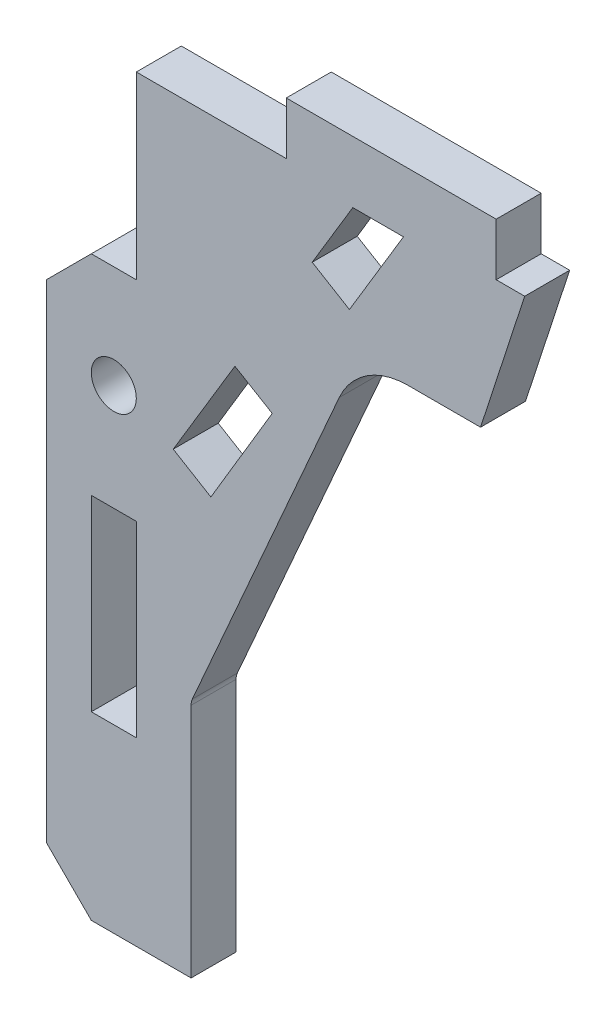
ISO-10303-21;
HEADER;
FILE_DESCRIPTION(('STEP AP214'),'2;1');
FILE_NAME('part.step','',(''),(''),'','','');
FILE_SCHEMA(('AUTOMOTIVE_DESIGN { 1 0 10303 214 1 1 1 1 }'));
ENDSEC;
DATA;
#1=APPLICATION_CONTEXT('core data for automotive mechanical design processes');
#2=APPLICATION_PROTOCOL_DEFINITION('international standard','automotive_design',2000,#1);
#3=PRODUCT_CONTEXT('',#1,'mechanical');
#4=PRODUCT('Part','Part','',(#3));
#5=PRODUCT_RELATED_PRODUCT_CATEGORY('part','',(#4));
#6=PRODUCT_DEFINITION_FORMATION('','',#4);
#7=PRODUCT_DEFINITION_CONTEXT('part definition',#1,'design');
#8=PRODUCT_DEFINITION('design','',#6,#7);
#9=PRODUCT_DEFINITION_SHAPE('','',#8);
#10=(LENGTH_UNIT() NAMED_UNIT(*) SI_UNIT(.MILLI.,.METRE.));
#11=(NAMED_UNIT(*) PLANE_ANGLE_UNIT() SI_UNIT($,.RADIAN.));
#12=(NAMED_UNIT(*) SI_UNIT($,.STERADIAN.) SOLID_ANGLE_UNIT());
#13=UNCERTAINTY_MEASURE_WITH_UNIT(LENGTH_MEASURE(1.E-05),#10,'distance_accuracy_value','');
#14=(GEOMETRIC_REPRESENTATION_CONTEXT(3) GLOBAL_UNCERTAINTY_ASSIGNED_CONTEXT((#13)) GLOBAL_UNIT_ASSIGNED_CONTEXT((#10,
#11,#12)) REPRESENTATION_CONTEXT('',''));
#15=CARTESIAN_POINT('',(0.,0.,0.));
#16=DIRECTION('',(0.,0.,1.));
#17=DIRECTION('',(1.,0.,0.));
#18=AXIS2_PLACEMENT_3D('',#15,#16,#17);
#19=CARTESIAN_POINT('',(0.,0.,3.));
#20=DIRECTION('',(0.,0.,1.));
#21=DIRECTION('',(1.,0.,0.));
#22=AXIS2_PLACEMENT_3D('',#19,#20,#21);
#23=PLANE('',#22);
#24=DIRECTION('',(0.,-1.,0.));
#25=VECTOR('',#24,1.);
#26=CARTESIAN_POINT('',(-18.7464779765645,-4.03817773949884,3.));
#27=LINE('',#26,#25);
#28=CARTESIAN_POINT('',(-18.7464779765645,-4.24802507912212,3.));
#29=VERTEX_POINT('',#28);
#30=CARTESIAN_POINT('',(-18.7464779765645,-20.0000000000003,3.));
#31=VERTEX_POINT('',#30);
#32=EDGE_CURVE('E235',#29,#31,#27,.T.);
#33=ORIENTED_EDGE('',*,*,#32,.F.);
#34=CARTESIAN_POINT('',(-17.7464779765645,-4.24802507912212,3.));
#35=DIRECTION('',(0.,0.,1.));
#36=DIRECTION('',(1.,0.,0.));
#37=AXIS2_PLACEMENT_3D('',#34,#35,#36);
#38=CIRCLE('',#37,1.);
#39=CARTESIAN_POINT('',(-18.6621209047509,-3.84603250697404,3.));
#40=VERTEX_POINT('',#39);
#41=EDGE_CURVE('E53',#29,#40,#38,.F.);
#42=ORIENTED_EDGE('',*,*,#41,.T.);
#43=DIRECTION('',(0.401992572148069,0.915642928186408,0.));
#44=VECTOR('',#43,1.);
#45=CARTESIAN_POINT('',(-7.98173309390254,20.4813363223423,3.));
#46=LINE('',#45,#44);
#47=CARTESIAN_POINT('',(-8.86454232708025,18.4705080451494,3.));
#48=VERTEX_POINT('',#47);
#49=EDGE_CURVE('E487',#40,#48,#46,.T.);
#50=ORIENTED_EDGE('',*,*,#49,.T.);
#51=CARTESIAN_POINT('',(-4.28632768614821,16.4605451844091,3.));
#52=DIRECTION('',(0.,0.,1.));
#53=DIRECTION('',(1.,0.,0.));
#54=AXIS2_PLACEMENT_3D('',#51,#52,#53);
#55=CIRCLE('',#54,5.);
#56=CARTESIAN_POINT('',(-4.28632768614821,21.4605451844091,3.));
#57=VERTEX_POINT('',#56);
#58=EDGE_CURVE('E373',#48,#57,#55,.F.);
#59=ORIENTED_EDGE('',*,*,#58,.T.);
#60=DIRECTION('',(1.,0.,0.));
#61=VECTOR('',#60,1.);
#62=CARTESIAN_POINT('',(0.,21.4605451844091,3.));
#63=LINE('',#62,#61);
#64=CARTESIAN_POINT('',(0.556836156925899,21.4605451844091,3.));
#65=VERTEX_POINT('',#64);
#66=EDGE_CURVE('E432',#57,#65,#63,.T.);
#67=ORIENTED_EDGE('',*,*,#66,.T.);
#68=DIRECTION('',(-0.309594182225636,-0.950868782920146,0.));
#69=VECTOR('',#68,1.);
#70=CARTESIAN_POINT('',(3.50000000000001,30.5,3.));
#71=LINE('',#70,#69);
#72=CARTESIAN_POINT('',(3.50000000000001,30.5,3.));
#73=VERTEX_POINT('',#72);
#74=EDGE_CURVE('E409',#73,#65,#71,.T.);
#75=ORIENTED_EDGE('',*,*,#74,.F.);
#76=DIRECTION('',(-1.,0.,0.));
#77=VECTOR('',#76,1.);
#78=CARTESIAN_POINT('',(17.4,30.5,3.));
#79=LINE('',#78,#77);
#80=CARTESIAN_POINT('',(1.60000000000001,30.5,3.));
#81=VERTEX_POINT('',#80);
#82=EDGE_CURVE('E261',#73,#81,#79,.T.);
#83=ORIENTED_EDGE('',*,*,#82,.T.);
#84=DIRECTION('',(0.,1.,0.));
#85=VECTOR('',#84,1.);
#86=CARTESIAN_POINT('',(1.60000000000001,30.5,3.));
#87=LINE('',#86,#85);
#88=CARTESIAN_POINT('',(1.60000000000001,34.,3.));
#89=VERTEX_POINT('',#88);
#90=EDGE_CURVE('E266',#81,#89,#87,.T.);
#91=ORIENTED_EDGE('',*,*,#90,.T.);
#92=DIRECTION('',(-1.,0.,0.));
#93=VECTOR('',#92,1.);
#94=CARTESIAN_POINT('',(1.60000000000001,34.,3.));
#95=LINE('',#94,#93);
#96=CARTESIAN_POINT('',(-12.4,34.,3.));
#97=VERTEX_POINT('',#96);
#98=EDGE_CURVE('E274',#89,#97,#95,.T.);
#99=ORIENTED_EDGE('',*,*,#98,.T.);
#100=DIRECTION('',(0.,-1.,0.));
#101=VECTOR('',#100,1.);
#102=CARTESIAN_POINT('',(-12.4,34.,3.));
#103=LINE('',#102,#101);
#104=CARTESIAN_POINT('',(-12.4,30.5,3.));
#105=VERTEX_POINT('',#104);
#106=EDGE_CURVE('E277',#97,#105,#103,.T.);
#107=ORIENTED_EDGE('',*,*,#106,.T.);
#108=DIRECTION('',(-1.,0.,0.));
#109=VECTOR('',#108,1.);
#110=CARTESIAN_POINT('',(-12.4,30.5,3.));
#111=LINE('',#110,#109);
#112=CARTESIAN_POINT('',(-22.4,30.5,3.));
#113=VERTEX_POINT('',#112);
#114=EDGE_CURVE('E280',#105,#113,#111,.T.);
#115=ORIENTED_EDGE('',*,*,#114,.T.);
#116=DIRECTION('',(0.,-1.,0.));
#117=VECTOR('',#116,1.);
#118=CARTESIAN_POINT('',(-22.4,30.5,3.));
#119=LINE('',#118,#117);
#120=CARTESIAN_POINT('',(-22.4,18.4999999999997,3.));
#121=VERTEX_POINT('',#120);
#122=EDGE_CURVE('E283',#113,#121,#119,.T.);
#123=ORIENTED_EDGE('',*,*,#122,.T.);
#124=DIRECTION('',(-1.,0.,0.));
#125=VECTOR('',#124,1.);
#126=CARTESIAN_POINT('',(-22.4,18.4999999999997,3.));
#127=LINE('',#126,#125);
#128=CARTESIAN_POINT('',(-25.4,18.4999999999997,3.));
#129=VERTEX_POINT('',#128);
#130=EDGE_CURVE('E286',#121,#129,#127,.T.);
#131=ORIENTED_EDGE('',*,*,#130,.T.);
#132=DIRECTION('',(-0.707106781186582,-0.707106781186513,0.));
#133=VECTOR('',#132,1.);
#134=CARTESIAN_POINT('',(-25.4,18.4999999999997,3.));
#135=LINE('',#134,#133);
#136=CARTESIAN_POINT('',(-28.4,15.5,3.));
#137=VERTEX_POINT('',#136);
#138=EDGE_CURVE('E289',#129,#137,#135,.T.);
#139=ORIENTED_EDGE('',*,*,#138,.T.);
#140=DIRECTION('',(0.,-1.,0.));
#141=VECTOR('',#140,1.);
#142=CARTESIAN_POINT('',(-28.4,15.5,3.));
#143=LINE('',#142,#141);
#144=CARTESIAN_POINT('',(-28.4,-17.,3.));
#145=VERTEX_POINT('',#144);
#146=EDGE_CURVE('E268',#137,#145,#143,.T.);
#147=ORIENTED_EDGE('',*,*,#146,.T.);
#148=DIRECTION('',(0.707106781186511,-0.707106781186583,0.));
#149=VECTOR('',#148,1.);
#150=CARTESIAN_POINT('',(-28.4,-17.,3.));
#151=LINE('',#150,#149);
#152=CARTESIAN_POINT('',(-25.4,-20.0000000000003,3.));
#153=VERTEX_POINT('',#152);
#154=EDGE_CURVE('E258',#145,#153,#151,.T.);
#155=ORIENTED_EDGE('',*,*,#154,.T.);
#156=DIRECTION('',(1.,0.,0.));
#157=VECTOR('',#156,1.);
#158=CARTESIAN_POINT('',(-25.4,-20.0000000000003,3.));
#159=LINE('',#158,#157);
#160=EDGE_CURVE('E250',#153,#31,#159,.T.);
#161=ORIENTED_EDGE('',*,*,#160,.T.);
#162=EDGE_LOOP('',(#33,#42,#50,#59,#67,#75,#83,#91,#99,#107,#115,#123,#131,#139,#147,#155,#161));
#163=FACE_BOUND('',#162,.T.);
#164=DIRECTION('',(0.514856100594363,0.857276615615268,0.));
#165=VECTOR('',#164,1.);
#166=CARTESIAN_POINT('',(-10.6696822295793,25.3771568352299,2.99999999999997));
#167=LINE('',#166,#165);
#168=CARTESIAN_POINT('',(-10.6696822295793,25.3771568352299,2.99999999999997));
#169=VERTEX_POINT('',#168);
#170=CARTESIAN_POINT('',(-7.96115572921821,29.8870702437596,2.99999999999997));
#171=VERTEX_POINT('',#170);
#172=EDGE_CURVE('E420',#169,#171,#167,.T.);
#173=ORIENTED_EDGE('',*,*,#172,.T.);
#174=DIRECTION('',(1.,0.,0.));
#175=VECTOR('',#174,1.);
#176=CARTESIAN_POINT('',(-7.96115572921821,29.8870702437596,2.99999999999997));
#177=LINE('',#176,#175);
#178=CARTESIAN_POINT('',(-4.58301705692235,29.8870702437596,3.));
#179=VERTEX_POINT('',#178);
#180=EDGE_CURVE('E438',#171,#179,#177,.T.);
#181=ORIENTED_EDGE('',*,*,#180,.T.);
#182=DIRECTION('',(-0.514856100594366,-0.857276615615266,0.));
#183=VECTOR('',#182,1.);
#184=CARTESIAN_POINT('',(-4.58301705692235,29.8870702437596,2.99999999999997));
#185=LINE('',#184,#183);
#186=CARTESIAN_POINT('',(-8.18700976108289,23.8861339344528,2.99999999999997));
#187=VERTEX_POINT('',#186);
#188=EDGE_CURVE('E441',#179,#187,#185,.T.);
#189=ORIENTED_EDGE('',*,*,#188,.T.);
#190=DIRECTION('',(-0.85727661561527,0.514856100594359,0.));
#191=VECTOR('',#190,1.);
#192=CARTESIAN_POINT('',(-8.18700976108289,23.8861339344528,2.99999999999997));
#193=LINE('',#192,#191);
#194=EDGE_CURVE('E446',#187,#169,#193,.T.);
#195=ORIENTED_EDGE('',*,*,#194,.T.);
#196=EDGE_LOOP('',(#173,#181,#189,#195));
#197=FACE_BOUND('',#196,.T.);
#198=DIRECTION('',(0.514856100594315,0.857276615615296,0.));
#199=VECTOR('',#198,1.);
#200=CARTESIAN_POINT('',(-19.937061462279,9.94622866896912,2.99999999999997));
#201=LINE('',#200,#199);
#202=CARTESIAN_POINT('',(-19.937061462279,9.94622866896912,2.99999999999997));
#203=VERTEX_POINT('',#202);
#204=CARTESIAN_POINT('',(-15.8239885694208,16.7948242382908,2.99999999999997));
#205=VERTEX_POINT('',#204);
#206=EDGE_CURVE('E406',#203,#205,#201,.T.);
#207=ORIENTED_EDGE('',*,*,#206,.T.);
#208=DIRECTION('',(0.859253727555359,-0.511549637554578,0.));
#209=VECTOR('',#208,1.);
#210=CARTESIAN_POINT('',(-15.8239885694208,16.7948242382908,2.99999999999997));
#211=LINE('',#210,#209);
#212=CARTESIAN_POINT('',(-13.335066930934,15.3130652173645,3.));
#213=VERTEX_POINT('',#212);
#214=EDGE_CURVE('E402',#205,#213,#211,.T.);
#215=ORIENTED_EDGE('',*,*,#214,.T.);
#216=DIRECTION('',(-0.511549637554567,-0.859253727555366,0.));
#217=VECTOR('',#216,1.);
#218=CARTESIAN_POINT('',(-13.335066930934,15.3130652173645,2.99999999999997));
#219=LINE('',#218,#217);
#220=CARTESIAN_POINT('',(-17.4274640313705,8.4390353969216,2.99999999999997));
#221=VERTEX_POINT('',#220);
#222=EDGE_CURVE('E405',#213,#221,#219,.T.);
#223=ORIENTED_EDGE('',*,*,#222,.T.);
#224=DIRECTION('',(-0.857276615615293,0.51485610059432,0.));
#225=VECTOR('',#224,1.);
#226=CARTESIAN_POINT('',(-17.4274640313705,8.4390353969216,2.99999999999997));
#227=LINE('',#226,#225);
#228=EDGE_CURVE('E456',#221,#203,#227,.T.);
#229=ORIENTED_EDGE('',*,*,#228,.T.);
#230=EDGE_LOOP('',(#207,#215,#223,#229));
#231=FACE_BOUND('',#230,.T.);
#232=CARTESIAN_POINT('',(-23.9,11.6451159513258,3.));
#233=DIRECTION('',(0.,0.,1.));
#234=DIRECTION('',(1.,0.,0.));
#235=AXIS2_PLACEMENT_3D('',#232,#233,#234);
#236=CIRCLE('',#235,1.50000000000001);
#237=CARTESIAN_POINT('',(-22.4,11.6451159513258,3.));
#238=VERTEX_POINT('',#237);
#239=EDGE_CURVE('E298',#238,#238,#236,.T.);
#240=ORIENTED_EDGE('',*,*,#239,.F.);
#241=EDGE_LOOP('',(#240));
#242=FACE_BOUND('',#241,.T.);
#243=DIRECTION('',(1.,0.,0.));
#244=VECTOR('',#243,1.);
#245=CARTESIAN_POINT('',(-22.4,-7.95118437305478,3.));
#246=LINE('',#245,#244);
#247=CARTESIAN_POINT('',(-25.4,-7.95118437305478,3.));
#248=VERTEX_POINT('',#247);
#249=CARTESIAN_POINT('',(-22.4,-7.95118437305478,3.));
#250=VERTEX_POINT('',#249);
#251=EDGE_CURVE('E496',#248,#250,#246,.T.);
#252=ORIENTED_EDGE('',*,*,#251,.F.);
#253=DIRECTION('',(0.,-1.,0.));
#254=VECTOR('',#253,1.);
#255=CARTESIAN_POINT('',(-25.4,-7.95118437305478,3.));
#256=LINE('',#255,#254);
#257=CARTESIAN_POINT('',(-25.4,4.5488156269452,3.));
#258=VERTEX_POINT('',#257);
#259=EDGE_CURVE('E399',#258,#248,#256,.T.);
#260=ORIENTED_EDGE('',*,*,#259,.F.);
#261=DIRECTION('',(-1.,0.,0.));
#262=VECTOR('',#261,1.);
#263=CARTESIAN_POINT('',(-25.4,4.5488156269452,3.));
#264=LINE('',#263,#262);
#265=CARTESIAN_POINT('',(-22.4,4.5488156269452,3.));
#266=VERTEX_POINT('',#265);
#267=EDGE_CURVE('E502',#266,#258,#264,.T.);
#268=ORIENTED_EDGE('',*,*,#267,.F.);
#269=DIRECTION('',(0.,1.,0.));
#270=VECTOR('',#269,1.);
#271=CARTESIAN_POINT('',(-22.4,4.5488156269452,3.));
#272=LINE('',#271,#270);
#273=EDGE_CURVE('E498',#250,#266,#272,.T.);
#274=ORIENTED_EDGE('',*,*,#273,.F.);
#275=EDGE_LOOP('',(#252,#260,#268,#274));
#276=FACE_BOUND('',#275,.T.);
#277=ADVANCED_FACE('F44',(#163,#197,#231,#242,#276),#23,.T.);
#278=CARTESIAN_POINT('',(0.,0.,0.));
#279=DIRECTION('',(0.,0.,1.));
#280=DIRECTION('',(1.,0.,0.));
#281=AXIS2_PLACEMENT_3D('',#278,#279,#280);
#282=PLANE('',#281);
#283=DIRECTION('',(1.,0.,0.));
#284=VECTOR('',#283,1.);
#285=CARTESIAN_POINT('',(-7.96115572921821,29.8870702437596,0.));
#286=LINE('',#285,#284);
#287=CARTESIAN_POINT('',(-7.96115572921821,29.8870702437596,0.));
#288=VERTEX_POINT('',#287);
#289=CARTESIAN_POINT('',(-4.58301705692235,29.8870702437596,0.));
#290=VERTEX_POINT('',#289);
#291=EDGE_CURVE('E552',#288,#290,#286,.T.);
#292=ORIENTED_EDGE('',*,*,#291,.F.);
#293=DIRECTION('',(0.514856100594363,0.857276615615268,0.));
#294=VECTOR('',#293,1.);
#295=CARTESIAN_POINT('',(-10.6696822295793,25.3771568352299,0.));
#296=LINE('',#295,#294);
#297=CARTESIAN_POINT('',(-10.6696822295793,25.3771568352299,0.));
#298=VERTEX_POINT('',#297);
#299=EDGE_CURVE('E473',#298,#288,#296,.T.);
#300=ORIENTED_EDGE('',*,*,#299,.F.);
#301=DIRECTION('',(-0.85727661561527,0.514856100594359,0.));
#302=VECTOR('',#301,1.);
#303=CARTESIAN_POINT('',(-8.18700976108289,23.8861339344528,0.));
#304=LINE('',#303,#302);
#305=CARTESIAN_POINT('',(-8.18700976108289,23.8861339344528,0.));
#306=VERTEX_POINT('',#305);
#307=EDGE_CURVE('E418',#306,#298,#304,.T.);
#308=ORIENTED_EDGE('',*,*,#307,.F.);
#309=DIRECTION('',(-0.514856100594366,-0.857276615615266,0.));
#310=VECTOR('',#309,1.);
#311=CARTESIAN_POINT('',(-4.58301705692235,29.8870702437596,0.));
#312=LINE('',#311,#310);
#313=EDGE_CURVE('E421',#290,#306,#312,.T.);
#314=ORIENTED_EDGE('',*,*,#313,.F.);
#315=EDGE_LOOP('',(#292,#300,#308,#314));
#316=FACE_BOUND('',#315,.T.);
#317=DIRECTION('',(0.859253727555359,-0.511549637554578,0.));
#318=VECTOR('',#317,1.);
#319=CARTESIAN_POINT('',(-15.8239885694208,16.7948242382908,0.));
#320=LINE('',#319,#318);
#321=CARTESIAN_POINT('',(-15.8239885694208,16.7948242382908,0.));
#322=VERTEX_POINT('',#321);
#323=CARTESIAN_POINT('',(-13.335066930934,15.3130652173645,0.));
#324=VERTEX_POINT('',#323);
#325=EDGE_CURVE('E424',#322,#324,#320,.T.);
#326=ORIENTED_EDGE('',*,*,#325,.F.);
#327=DIRECTION('',(0.514856100594315,0.857276615615296,0.));
#328=VECTOR('',#327,1.);
#329=CARTESIAN_POINT('',(-19.937061462279,9.94622866896912,0.));
#330=LINE('',#329,#328);
#331=CARTESIAN_POINT('',(-19.937061462279,9.94622866896912,0.));
#332=VERTEX_POINT('',#331);
#333=EDGE_CURVE('E427',#332,#322,#330,.T.);
#334=ORIENTED_EDGE('',*,*,#333,.F.);
#335=DIRECTION('',(-0.857276615615293,0.51485610059432,0.));
#336=VECTOR('',#335,1.);
#337=CARTESIAN_POINT('',(-17.4274640313705,8.4390353969216,0.));
#338=LINE('',#337,#336);
#339=CARTESIAN_POINT('',(-17.4274640313705,8.4390353969216,0.));
#340=VERTEX_POINT('',#339);
#341=EDGE_CURVE('E413',#340,#332,#338,.T.);
#342=ORIENTED_EDGE('',*,*,#341,.F.);
#343=DIRECTION('',(-0.511549637554567,-0.859253727555366,0.));
#344=VECTOR('',#343,1.);
#345=CARTESIAN_POINT('',(-13.335066930934,15.3130652173645,0.));
#346=LINE('',#345,#344);
#347=EDGE_CURVE('E416',#324,#340,#346,.T.);
#348=ORIENTED_EDGE('',*,*,#347,.F.);
#349=EDGE_LOOP('',(#326,#334,#342,#348));
#350=FACE_BOUND('',#349,.T.);
#351=DIRECTION('',(0.,-1.,0.));
#352=VECTOR('',#351,1.);
#353=CARTESIAN_POINT('',(-25.4,-7.95118437305478,0.));
#354=LINE('',#353,#352);
#355=CARTESIAN_POINT('',(-25.4,4.5488156269452,0.));
#356=VERTEX_POINT('',#355);
#357=CARTESIAN_POINT('',(-25.4,-7.95118437305478,0.));
#358=VERTEX_POINT('',#357);
#359=EDGE_CURVE('E452',#356,#358,#354,.T.);
#360=ORIENTED_EDGE('',*,*,#359,.T.);
#361=DIRECTION('',(1.,0.,0.));
#362=VECTOR('',#361,1.);
#363=CARTESIAN_POINT('',(-22.4,-7.95118437305478,0.));
#364=LINE('',#363,#362);
#365=CARTESIAN_POINT('',(-22.4,-7.95118437305478,0.));
#366=VERTEX_POINT('',#365);
#367=EDGE_CURVE('E449',#358,#366,#364,.T.);
#368=ORIENTED_EDGE('',*,*,#367,.T.);
#369=DIRECTION('',(0.,1.,0.));
#370=VECTOR('',#369,1.);
#371=CARTESIAN_POINT('',(-22.4,4.5488156269452,0.));
#372=LINE('',#371,#370);
#373=CARTESIAN_POINT('',(-22.4,4.5488156269452,0.));
#374=VERTEX_POINT('',#373);
#375=EDGE_CURVE('E400',#366,#374,#372,.T.);
#376=ORIENTED_EDGE('',*,*,#375,.T.);
#377=DIRECTION('',(-1.,0.,0.));
#378=VECTOR('',#377,1.);
#379=CARTESIAN_POINT('',(-25.4,4.5488156269452,0.));
#380=LINE('',#379,#378);
#381=EDGE_CURVE('E396',#374,#356,#380,.T.);
#382=ORIENTED_EDGE('',*,*,#381,.T.);
#383=EDGE_LOOP('',(#360,#368,#376,#382));
#384=FACE_BOUND('',#383,.T.);
#385=CARTESIAN_POINT('',(-23.9,11.6451159513258,0.));
#386=DIRECTION('',(0.,0.,1.));
#387=DIRECTION('',(1.,0.,0.));
#388=AXIS2_PLACEMENT_3D('',#385,#386,#387);
#389=CIRCLE('',#388,1.50000000000001);
#390=CARTESIAN_POINT('',(-22.4,11.6451159513258,0.));
#391=VERTEX_POINT('',#390);
#392=EDGE_CURVE('E520',#391,#391,#389,.T.);
#393=ORIENTED_EDGE('',*,*,#392,.T.);
#394=EDGE_LOOP('',(#393));
#395=FACE_BOUND('',#394,.T.);
#396=DIRECTION('',(-0.401992572148069,-0.915642928186408,0.));
#397=VECTOR('',#396,1.);
#398=CARTESIAN_POINT('',(-7.98173309390254,20.4813363223423,0.));
#399=LINE('',#398,#397);
#400=CARTESIAN_POINT('',(-8.86454232708025,18.4705080451494,0.));
#401=VERTEX_POINT('',#400);
#402=CARTESIAN_POINT('',(-18.6621209047509,-3.84603250697405,0.));
#403=VERTEX_POINT('',#402);
#404=EDGE_CURVE('E489',#401,#403,#399,.T.);
#405=ORIENTED_EDGE('',*,*,#404,.T.);
#406=CARTESIAN_POINT('',(-17.7464779765645,-4.24802507912212,0.));
#407=DIRECTION('',(0.,0.,1.));
#408=DIRECTION('',(1.,0.,0.));
#409=AXIS2_PLACEMENT_3D('',#406,#407,#408);
#410=CIRCLE('',#409,1.);
#411=CARTESIAN_POINT('',(-18.7464779765645,-4.24802507912212,0.));
#412=VERTEX_POINT('',#411);
#413=EDGE_CURVE('E11',#403,#412,#410,.T.);
#414=ORIENTED_EDGE('',*,*,#413,.T.);
#415=DIRECTION('',(0.,-1.,0.));
#416=VECTOR('',#415,1.);
#417=CARTESIAN_POINT('',(-18.7464779765645,0.,0.));
#418=LINE('',#417,#416);
#419=CARTESIAN_POINT('',(-18.7464779765645,-20.0000000000003,0.));
#420=VERTEX_POINT('',#419);
#421=EDGE_CURVE('E254',#412,#420,#418,.T.);
#422=ORIENTED_EDGE('',*,*,#421,.T.);
#423=DIRECTION('',(1.,0.,0.));
#424=VECTOR('',#423,1.);
#425=CARTESIAN_POINT('',(-25.4,-20.0000000000003,0.));
#426=LINE('',#425,#424);
#427=CARTESIAN_POINT('',(-25.4,-20.0000000000003,0.));
#428=VERTEX_POINT('',#427);
#429=EDGE_CURVE('E252',#428,#420,#426,.T.);
#430=ORIENTED_EDGE('',*,*,#429,.F.);
#431=DIRECTION('',(0.707106781186511,-0.707106781186583,0.));
#432=VECTOR('',#431,1.);
#433=CARTESIAN_POINT('',(-28.4,-17.,0.));
#434=LINE('',#433,#432);
#435=CARTESIAN_POINT('',(-28.4,-17.,0.));
#436=VERTEX_POINT('',#435);
#437=EDGE_CURVE('E297',#436,#428,#434,.T.);
#438=ORIENTED_EDGE('',*,*,#437,.F.);
#439=DIRECTION('',(0.,-1.,0.));
#440=VECTOR('',#439,1.);
#441=CARTESIAN_POINT('',(-28.4,15.5,0.));
#442=LINE('',#441,#440);
#443=CARTESIAN_POINT('',(-28.4,15.5,0.));
#444=VERTEX_POINT('',#443);
#445=EDGE_CURVE('E293',#444,#436,#442,.T.);
#446=ORIENTED_EDGE('',*,*,#445,.F.);
#447=DIRECTION('',(-0.707106781186582,-0.707106781186513,0.));
#448=VECTOR('',#447,1.);
#449=CARTESIAN_POINT('',(-25.4,18.4999999999997,0.));
#450=LINE('',#449,#448);
#451=CARTESIAN_POINT('',(-25.4,18.4999999999997,0.));
#452=VERTEX_POINT('',#451);
#453=EDGE_CURVE('E324',#452,#444,#450,.T.);
#454=ORIENTED_EDGE('',*,*,#453,.F.);
#455=DIRECTION('',(-1.,0.,0.));
#456=VECTOR('',#455,1.);
#457=CARTESIAN_POINT('',(-22.4,18.4999999999997,0.));
#458=LINE('',#457,#456);
#459=CARTESIAN_POINT('',(-22.4,18.4999999999997,0.));
#460=VERTEX_POINT('',#459);
#461=EDGE_CURVE('E321',#460,#452,#458,.T.);
#462=ORIENTED_EDGE('',*,*,#461,.F.);
#463=DIRECTION('',(0.,-1.,0.));
#464=VECTOR('',#463,1.);
#465=CARTESIAN_POINT('',(-22.4,30.5,0.));
#466=LINE('',#465,#464);
#467=CARTESIAN_POINT('',(-22.4,30.5,0.));
#468=VERTEX_POINT('',#467);
#469=EDGE_CURVE('E318',#468,#460,#466,.T.);
#470=ORIENTED_EDGE('',*,*,#469,.F.);
#471=DIRECTION('',(-1.,0.,0.));
#472=VECTOR('',#471,1.);
#473=CARTESIAN_POINT('',(-12.4,30.5,0.));
#474=LINE('',#473,#472);
#475=CARTESIAN_POINT('',(-12.4,30.5,0.));
#476=VERTEX_POINT('',#475);
#477=EDGE_CURVE('E315',#476,#468,#474,.T.);
#478=ORIENTED_EDGE('',*,*,#477,.F.);
#479=DIRECTION('',(0.,-1.,0.));
#480=VECTOR('',#479,1.);
#481=CARTESIAN_POINT('',(-12.4,34.,0.));
#482=LINE('',#481,#480);
#483=CARTESIAN_POINT('',(-12.4,34.,0.));
#484=VERTEX_POINT('',#483);
#485=EDGE_CURVE('E312',#484,#476,#482,.T.);
#486=ORIENTED_EDGE('',*,*,#485,.F.);
#487=DIRECTION('',(-1.,0.,0.));
#488=VECTOR('',#487,1.);
#489=CARTESIAN_POINT('',(1.60000000000001,34.,0.));
#490=LINE('',#489,#488);
#491=CARTESIAN_POINT('',(1.60000000000001,34.,0.));
#492=VERTEX_POINT('',#491);
#493=EDGE_CURVE('E309',#492,#484,#490,.T.);
#494=ORIENTED_EDGE('',*,*,#493,.F.);
#495=DIRECTION('',(0.,1.,0.));
#496=VECTOR('',#495,1.);
#497=CARTESIAN_POINT('',(1.60000000000001,30.5,0.));
#498=LINE('',#497,#496);
#499=CARTESIAN_POINT('',(1.60000000000001,30.5,0.));
#500=VERTEX_POINT('',#499);
#501=EDGE_CURVE('E306',#500,#492,#498,.T.);
#502=ORIENTED_EDGE('',*,*,#501,.F.);
#503=DIRECTION('',(-1.,0.,0.));
#504=VECTOR('',#503,1.);
#505=CARTESIAN_POINT('',(17.4,30.5,0.));
#506=LINE('',#505,#504);
#507=CARTESIAN_POINT('',(3.50000000000001,30.5,0.));
#508=VERTEX_POINT('',#507);
#509=EDGE_CURVE('E303',#508,#500,#506,.T.);
#510=ORIENTED_EDGE('',*,*,#509,.F.);
#511=DIRECTION('',(-0.309594182225637,-0.950868782920146,0.));
#512=VECTOR('',#511,1.);
#513=CARTESIAN_POINT('',(-5.81416497102534,1.89303895749063,0.));
#514=LINE('',#513,#512);
#515=CARTESIAN_POINT('',(0.556836156925899,21.4605451844091,0.));
#516=VERTEX_POINT('',#515);
#517=EDGE_CURVE('E435',#508,#516,#514,.T.);
#518=ORIENTED_EDGE('',*,*,#517,.T.);
#519=DIRECTION('',(-1.,0.,0.));
#520=VECTOR('',#519,1.);
#521=CARTESIAN_POINT('',(0.,21.4605451844091,0.));
#522=LINE('',#521,#520);
#523=CARTESIAN_POINT('',(-4.28632768614821,21.4605451844091,0.));
#524=VERTEX_POINT('',#523);
#525=EDGE_CURVE('E434',#516,#524,#522,.T.);
#526=ORIENTED_EDGE('',*,*,#525,.T.);
#527=CARTESIAN_POINT('',(-4.28632768614821,16.4605451844091,0.));
#528=DIRECTION('',(0.,0.,1.));
#529=DIRECTION('',(1.,0.,0.));
#530=AXIS2_PLACEMENT_3D('',#527,#528,#529);
#531=CIRCLE('',#530,5.);
#532=EDGE_CURVE('E376',#524,#401,#531,.T.);
#533=ORIENTED_EDGE('',*,*,#532,.T.);
#534=EDGE_LOOP('',(#405,#414,#422,#430,#438,#446,#454,#462,#470,#478,#486,#494,#502,#510,#518,
#526,#533));
#535=FACE_BOUND('',#534,.T.);
#536=ADVANCED_FACE('F536',(#316,#350,#384,#395,#535),#282,.F.);
#537=CARTESIAN_POINT('',(17.4,30.5,3.));
#538=DIRECTION('',(0.,-1.,0.));
#539=DIRECTION('',(0.,0.,-1.));
#540=AXIS2_PLACEMENT_3D('',#537,#538,#539);
#541=PLANE('',#540);
#542=ORIENTED_EDGE('',*,*,#82,.F.);
#543=DIRECTION('',(0.,0.,1.));
#544=VECTOR('',#543,1.);
#545=CARTESIAN_POINT('',(3.50000000000001,30.5,-7.));
#546=LINE('',#545,#544);
#547=EDGE_CURVE('E430',#508,#73,#546,.T.);
#548=ORIENTED_EDGE('',*,*,#547,.F.);
#549=ORIENTED_EDGE('',*,*,#509,.T.);
#550=DIRECTION('',(0.,0.,-1.));
#551=VECTOR('',#550,1.);
#552=CARTESIAN_POINT('',(1.60000000000001,30.5,3.));
#553=LINE('',#552,#551);
#554=EDGE_CURVE('E354',#81,#500,#553,.T.);
#555=ORIENTED_EDGE('',*,*,#554,.F.);
#556=EDGE_LOOP('',(#542,#548,#549,#555));
#557=FACE_BOUND('',#556,.T.);
#558=ADVANCED_FACE('F583',(#557),#541,.F.);
#559=CARTESIAN_POINT('',(0.,21.4605451844091,-18.1607801937132));
#560=DIRECTION('',(0.,-1.,0.));
#561=DIRECTION('',(0.,0.,-1.));
#562=AXIS2_PLACEMENT_3D('',#559,#560,#561);
#563=PLANE('',#562);
#564=DIRECTION('',(0.,0.,1.));
#565=VECTOR('',#564,1.);
#566=CARTESIAN_POINT('',(0.556836156925899,21.4605451844091,-7.));
#567=LINE('',#566,#565);
#568=EDGE_CURVE('E477',#516,#65,#567,.T.);
#569=ORIENTED_EDGE('',*,*,#568,.T.);
#570=ORIENTED_EDGE('',*,*,#66,.F.);
#571=DIRECTION('',(0.,0.,1.));
#572=VECTOR('',#571,1.);
#573=CARTESIAN_POINT('',(-4.28632768614821,21.4605451844091,0.));
#574=LINE('',#573,#572);
#575=EDGE_CURVE('E369',#57,#524,#574,.F.);
#576=ORIENTED_EDGE('',*,*,#575,.T.);
#577=ORIENTED_EDGE('',*,*,#525,.F.);
#578=EDGE_LOOP('',(#569,#570,#576,#577));
#579=FACE_BOUND('',#578,.T.);
#580=ADVANCED_FACE('F635',(#579),#563,.T.);
#581=CARTESIAN_POINT('',(-28.4,15.5,3.));
#582=DIRECTION('',(1.,0.,0.));
#583=DIRECTION('',(0.,0.,-1.));
#584=AXIS2_PLACEMENT_3D('',#581,#582,#583);
#585=PLANE('',#584);
#586=ORIENTED_EDGE('',*,*,#445,.T.);
#587=DIRECTION('',(0.,0.,-1.));
#588=VECTOR('',#587,1.);
#589=CARTESIAN_POINT('',(-28.4,-17.,3.));
#590=LINE('',#589,#588);
#591=EDGE_CURVE('E361',#145,#436,#590,.T.);
#592=ORIENTED_EDGE('',*,*,#591,.F.);
#593=ORIENTED_EDGE('',*,*,#146,.F.);
#594=DIRECTION('',(0.,0.,-1.));
#595=VECTOR('',#594,1.);
#596=CARTESIAN_POINT('',(-28.4,15.5,3.));
#597=LINE('',#596,#595);
#598=EDGE_CURVE('E292',#137,#444,#597,.T.);
#599=ORIENTED_EDGE('',*,*,#598,.T.);
#600=EDGE_LOOP('',(#586,#592,#593,#599));
#601=FACE_BOUND('',#600,.T.);
#602=ADVANCED_FACE('F531',(#601),#585,.F.);
#603=CARTESIAN_POINT('',(-28.4,-17.,3.));
#604=DIRECTION('',(0.707106781186584,0.707106781186511,0.));
#605=DIRECTION('',(-0.707106781186511,0.707106781186584,0.));
#606=AXIS2_PLACEMENT_3D('',#603,#604,#605);
#607=PLANE('',#606);
#608=ORIENTED_EDGE('',*,*,#437,.T.);
#609=DIRECTION('',(0.,0.,-1.));
#610=VECTOR('',#609,1.);
#611=CARTESIAN_POINT('',(-25.4,-20.0000000000003,3.));
#612=LINE('',#611,#610);
#613=EDGE_CURVE('E358',#153,#428,#612,.T.);
#614=ORIENTED_EDGE('',*,*,#613,.F.);
#615=ORIENTED_EDGE('',*,*,#154,.F.);
#616=ORIENTED_EDGE('',*,*,#591,.T.);
#617=EDGE_LOOP('',(#608,#614,#615,#616));
#618=FACE_BOUND('',#617,.T.);
#619=ADVANCED_FACE('F534',(#618),#607,.F.);
#620=CARTESIAN_POINT('',(-25.4,-20.0000000000003,3.));
#621=DIRECTION('',(0.,1.,0.));
#622=DIRECTION('',(0.,0.,1.));
#623=AXIS2_PLACEMENT_3D('',#620,#621,#622);
#624=PLANE('',#623);
#625=ORIENTED_EDGE('',*,*,#429,.T.);
#626=DIRECTION('',(0.,0.,1.));
#627=VECTOR('',#626,1.);
#628=CARTESIAN_POINT('',(-18.7464779765645,-20.0000000000003,-7.));
#629=LINE('',#628,#627);
#630=EDGE_CURVE('E239',#420,#31,#629,.T.);
#631=ORIENTED_EDGE('',*,*,#630,.T.);
#632=ORIENTED_EDGE('',*,*,#160,.F.);
#633=ORIENTED_EDGE('',*,*,#613,.T.);
#634=EDGE_LOOP('',(#625,#631,#632,#633));
#635=FACE_BOUND('',#634,.T.);
#636=ADVANCED_FACE('F248',(#635),#624,.F.);
#637=CARTESIAN_POINT('',(1.60000000000001,30.5,3.));
#638=DIRECTION('',(-1.,0.,0.));
#639=DIRECTION('',(0.,0.,1.));
#640=AXIS2_PLACEMENT_3D('',#637,#638,#639);
#641=PLANE('',#640);
#642=ORIENTED_EDGE('',*,*,#501,.T.);
#643=DIRECTION('',(0.,0.,-1.));
#644=VECTOR('',#643,1.);
#645=CARTESIAN_POINT('',(1.60000000000001,34.,3.));
#646=LINE('',#645,#644);
#647=EDGE_CURVE('E350',#89,#492,#646,.T.);
#648=ORIENTED_EDGE('',*,*,#647,.F.);
#649=ORIENTED_EDGE('',*,*,#90,.F.);
#650=ORIENTED_EDGE('',*,*,#554,.T.);
#651=EDGE_LOOP('',(#642,#648,#649,#650));
#652=FACE_BOUND('',#651,.T.);
#653=ADVANCED_FACE('F628',(#652),#641,.F.);
#654=CARTESIAN_POINT('',(1.60000000000001,34.,3.));
#655=DIRECTION('',(0.,-1.,0.));
#656=DIRECTION('',(0.,0.,-1.));
#657=AXIS2_PLACEMENT_3D('',#654,#655,#656);
#658=PLANE('',#657);
#659=ORIENTED_EDGE('',*,*,#493,.T.);
#660=DIRECTION('',(0.,0.,-1.));
#661=VECTOR('',#660,1.);
#662=CARTESIAN_POINT('',(-12.4,34.,3.));
#663=LINE('',#662,#661);
#664=EDGE_CURVE('E346',#97,#484,#663,.T.);
#665=ORIENTED_EDGE('',*,*,#664,.F.);
#666=ORIENTED_EDGE('',*,*,#98,.F.);
#667=ORIENTED_EDGE('',*,*,#647,.T.);
#668=EDGE_LOOP('',(#659,#665,#666,#667));
#669=FACE_BOUND('',#668,.T.);
#670=ADVANCED_FACE('F624',(#669),#658,.F.);
#671=CARTESIAN_POINT('',(-12.4,34.,3.));
#672=DIRECTION('',(1.,0.,0.));
#673=DIRECTION('',(0.,0.,-1.));
#674=AXIS2_PLACEMENT_3D('',#671,#672,#673);
#675=PLANE('',#674);
#676=ORIENTED_EDGE('',*,*,#485,.T.);
#677=DIRECTION('',(0.,0.,-1.));
#678=VECTOR('',#677,1.);
#679=CARTESIAN_POINT('',(-12.4,30.5,3.));
#680=LINE('',#679,#678);
#681=EDGE_CURVE('E342',#105,#476,#680,.T.);
#682=ORIENTED_EDGE('',*,*,#681,.F.);
#683=ORIENTED_EDGE('',*,*,#106,.F.);
#684=ORIENTED_EDGE('',*,*,#664,.T.);
#685=EDGE_LOOP('',(#676,#682,#683,#684));
#686=FACE_BOUND('',#685,.T.);
#687=ADVANCED_FACE('F620',(#686),#675,.F.);
#688=CARTESIAN_POINT('',(-12.4,30.5,3.));
#689=DIRECTION('',(0.,-1.,0.));
#690=DIRECTION('',(0.,0.,-1.));
#691=AXIS2_PLACEMENT_3D('',#688,#689,#690);
#692=PLANE('',#691);
#693=ORIENTED_EDGE('',*,*,#477,.T.);
#694=DIRECTION('',(0.,0.,-1.));
#695=VECTOR('',#694,1.);
#696=CARTESIAN_POINT('',(-22.4,30.5,3.));
#697=LINE('',#696,#695);
#698=EDGE_CURVE('E338',#113,#468,#697,.T.);
#699=ORIENTED_EDGE('',*,*,#698,.F.);
#700=ORIENTED_EDGE('',*,*,#114,.F.);
#701=ORIENTED_EDGE('',*,*,#681,.T.);
#702=EDGE_LOOP('',(#693,#699,#700,#701));
#703=FACE_BOUND('',#702,.T.);
#704=ADVANCED_FACE('F616',(#703),#692,.F.);
#705=CARTESIAN_POINT('',(-22.4,30.5,3.));
#706=DIRECTION('',(1.,0.,0.));
#707=DIRECTION('',(0.,0.,-1.));
#708=AXIS2_PLACEMENT_3D('',#705,#706,#707);
#709=PLANE('',#708);
#710=ORIENTED_EDGE('',*,*,#469,.T.);
#711=DIRECTION('',(0.,0.,-1.));
#712=VECTOR('',#711,1.);
#713=CARTESIAN_POINT('',(-22.4,18.4999999999997,3.));
#714=LINE('',#713,#712);
#715=EDGE_CURVE('E334',#121,#460,#714,.T.);
#716=ORIENTED_EDGE('',*,*,#715,.F.);
#717=ORIENTED_EDGE('',*,*,#122,.F.);
#718=ORIENTED_EDGE('',*,*,#698,.T.);
#719=EDGE_LOOP('',(#710,#716,#717,#718));
#720=FACE_BOUND('',#719,.T.);
#721=ADVANCED_FACE('F612',(#720),#709,.F.);
#722=CARTESIAN_POINT('',(-22.4,18.4999999999997,3.));
#723=DIRECTION('',(0.,-1.,0.));
#724=DIRECTION('',(1.,0.,0.));
#725=AXIS2_PLACEMENT_3D('',#722,#723,#724);
#726=PLANE('',#725);
#727=ORIENTED_EDGE('',*,*,#461,.T.);
#728=DIRECTION('',(0.,0.,-1.));
#729=VECTOR('',#728,1.);
#730=CARTESIAN_POINT('',(-25.4,18.4999999999997,3.));
#731=LINE('',#730,#729);
#732=EDGE_CURVE('E330',#129,#452,#731,.T.);
#733=ORIENTED_EDGE('',*,*,#732,.F.);
#734=ORIENTED_EDGE('',*,*,#130,.F.);
#735=ORIENTED_EDGE('',*,*,#715,.T.);
#736=EDGE_LOOP('',(#727,#733,#734,#735));
#737=FACE_BOUND('',#736,.T.);
#738=ADVANCED_FACE('F602',(#737),#726,.F.);
#739=CARTESIAN_POINT('',(-25.4,18.4999999999997,3.));
#740=DIRECTION('',(0.707106781186513,-0.707106781186582,0.));
#741=DIRECTION('',(0.707106781186582,0.707106781186513,0.));
#742=AXIS2_PLACEMENT_3D('',#739,#740,#741);
#743=PLANE('',#742);
#744=ORIENTED_EDGE('',*,*,#453,.T.);
#745=ORIENTED_EDGE('',*,*,#598,.F.);
#746=ORIENTED_EDGE('',*,*,#138,.F.);
#747=ORIENTED_EDGE('',*,*,#732,.T.);
#748=EDGE_LOOP('',(#744,#745,#746,#747));
#749=FACE_BOUND('',#748,.T.);
#750=ADVANCED_FACE('F592',(#749),#743,.F.);
#751=CARTESIAN_POINT('',(-23.9,11.6451159513258,3.));
#752=DIRECTION('',(0.,0.,-1.));
#753=DIRECTION('',(-1.,0.,0.));
#754=AXIS2_PLACEMENT_3D('',#751,#752,#753);
#755=CYLINDRICAL_SURFACE('',#754,1.50000000000001);
#756=ORIENTED_EDGE('',*,*,#239,.T.);
#757=EDGE_LOOP('',(#756));
#758=FACE_BOUND('',#757,.T.);
#759=ORIENTED_EDGE('',*,*,#392,.F.);
#760=EDGE_LOOP('',(#759));
#761=FACE_BOUND('',#760,.T.);
#762=ADVANCED_FACE('F589',(#758,#761),#755,.F.);
#763=CARTESIAN_POINT('',(-25.4,-7.95118437305478,3.));
#764=DIRECTION('',(1.,0.,0.));
#765=DIRECTION('',(0.,0.,-1.));
#766=AXIS2_PLACEMENT_3D('',#763,#764,#765);
#767=PLANE('',#766);
#768=ORIENTED_EDGE('',*,*,#359,.F.);
#769=DIRECTION('',(0.,0.,-1.));
#770=VECTOR('',#769,1.);
#771=CARTESIAN_POINT('',(-25.4,4.5488156269452,3.));
#772=LINE('',#771,#770);
#773=EDGE_CURVE('E505',#258,#356,#772,.T.);
#774=ORIENTED_EDGE('',*,*,#773,.F.);
#775=ORIENTED_EDGE('',*,*,#259,.T.);
#776=DIRECTION('',(0.,0.,-1.));
#777=VECTOR('',#776,1.);
#778=CARTESIAN_POINT('',(-25.4,-7.95118437305478,3.));
#779=LINE('',#778,#777);
#780=EDGE_CURVE('E392',#248,#358,#779,.T.);
#781=ORIENTED_EDGE('',*,*,#780,.T.);
#782=EDGE_LOOP('',(#768,#774,#775,#781));
#783=FACE_BOUND('',#782,.T.);
#784=ADVANCED_FACE('F591',(#783),#767,.T.);
#785=CARTESIAN_POINT('',(-22.4,-7.95118437305478,3.));
#786=DIRECTION('',(0.,1.,0.));
#787=DIRECTION('',(0.,0.,1.));
#788=AXIS2_PLACEMENT_3D('',#785,#786,#787);
#789=PLANE('',#788);
#790=ORIENTED_EDGE('',*,*,#367,.F.);
#791=ORIENTED_EDGE('',*,*,#780,.F.);
#792=ORIENTED_EDGE('',*,*,#251,.T.);
#793=DIRECTION('',(0.,0.,-1.));
#794=VECTOR('',#793,1.);
#795=CARTESIAN_POINT('',(-22.4,-7.95118437305478,3.));
#796=LINE('',#795,#794);
#797=EDGE_CURVE('E391',#250,#366,#796,.T.);
#798=ORIENTED_EDGE('',*,*,#797,.T.);
#799=EDGE_LOOP('',(#790,#791,#792,#798));
#800=FACE_BOUND('',#799,.T.);
#801=ADVANCED_FACE('F599',(#800),#789,.T.);
#802=CARTESIAN_POINT('',(-22.4,4.5488156269452,3.));
#803=DIRECTION('',(-1.,0.,0.));
#804=DIRECTION('',(0.,0.,1.));
#805=AXIS2_PLACEMENT_3D('',#802,#803,#804);
#806=PLANE('',#805);
#807=ORIENTED_EDGE('',*,*,#375,.F.);
#808=ORIENTED_EDGE('',*,*,#797,.F.);
#809=ORIENTED_EDGE('',*,*,#273,.T.);
#810=DIRECTION('',(0.,0.,-1.));
#811=VECTOR('',#810,1.);
#812=CARTESIAN_POINT('',(-22.4,4.5488156269452,3.));
#813=LINE('',#812,#811);
#814=EDGE_CURVE('E393',#266,#374,#813,.T.);
#815=ORIENTED_EDGE('',*,*,#814,.T.);
#816=EDGE_LOOP('',(#807,#808,#809,#815));
#817=FACE_BOUND('',#816,.T.);
#818=ADVANCED_FACE('F698',(#817),#806,.T.);
#819=CARTESIAN_POINT('',(-25.4,4.5488156269452,3.));
#820=DIRECTION('',(0.,-1.,0.));
#821=DIRECTION('',(0.,0.,-1.));
#822=AXIS2_PLACEMENT_3D('',#819,#820,#821);
#823=PLANE('',#822);
#824=ORIENTED_EDGE('',*,*,#381,.F.);
#825=ORIENTED_EDGE('',*,*,#814,.F.);
#826=ORIENTED_EDGE('',*,*,#267,.T.);
#827=ORIENTED_EDGE('',*,*,#773,.T.);
#828=EDGE_LOOP('',(#824,#825,#826,#827));
#829=FACE_BOUND('',#828,.T.);
#830=ADVANCED_FACE('F653',(#829),#823,.T.);
#831=CARTESIAN_POINT('',(-7.98173309390254,20.4813363223423,-10.8448910884483));
#832=DIRECTION('',(0.915642928186408,-0.401992572148069,0.));
#833=DIRECTION('',(0.401992572148069,0.915642928186408,0.));
#834=AXIS2_PLACEMENT_3D('',#831,#832,#833);
#835=PLANE('',#834);
#836=ORIENTED_EDGE('',*,*,#49,.F.);
#837=DIRECTION('',(0.,0.,1.));
#838=VECTOR('',#837,1.);
#839=CARTESIAN_POINT('',(-18.6621209047509,-3.84603250697405,-10.8448910884483));
#840=LINE('',#839,#838);
#841=EDGE_CURVE('E66',#40,#403,#840,.F.);
#842=ORIENTED_EDGE('',*,*,#841,.T.);
#843=ORIENTED_EDGE('',*,*,#404,.F.);
#844=DIRECTION('',(0.,0.,1.));
#845=VECTOR('',#844,1.);
#846=CARTESIAN_POINT('',(-8.86454232708025,18.4705080451494,3.));
#847=LINE('',#846,#845);
#848=EDGE_CURVE('E365',#401,#48,#847,.T.);
#849=ORIENTED_EDGE('',*,*,#848,.T.);
#850=EDGE_LOOP('',(#836,#842,#843,#849));
#851=FACE_BOUND('',#850,.T.);
#852=ADVANCED_FACE('F645',(#851),#835,.T.);
#853=CARTESIAN_POINT('',(-4.28632768614821,16.4605451844091,-10.8448910884483));
#854=DIRECTION('',(0.,0.,-1.));
#855=DIRECTION('',(-1.,0.,0.));
#856=AXIS2_PLACEMENT_3D('',#853,#854,#855);
#857=CYLINDRICAL_SURFACE('',#856,5.);
#858=ORIENTED_EDGE('',*,*,#532,.F.);
#859=ORIENTED_EDGE('',*,*,#575,.F.);
#860=ORIENTED_EDGE('',*,*,#58,.F.);
#861=ORIENTED_EDGE('',*,*,#848,.F.);
#862=EDGE_LOOP('',(#858,#859,#860,#861));
#863=FACE_BOUND('',#862,.T.);
#864=ADVANCED_FACE('F642',(#863),#857,.F.);
#865=CARTESIAN_POINT('',(3.50000000000001,30.5,-7.));
#866=DIRECTION('',(-0.950868782920146,0.309594182225636,0.));
#867=DIRECTION('',(-0.309594182225637,-0.950868782920146,0.));
#868=AXIS2_PLACEMENT_3D('',#865,#866,#867);
#869=PLANE('',#868);
#870=ORIENTED_EDGE('',*,*,#547,.T.);
#871=ORIENTED_EDGE('',*,*,#74,.T.);
#872=ORIENTED_EDGE('',*,*,#568,.F.);
#873=ORIENTED_EDGE('',*,*,#517,.F.);
#874=EDGE_LOOP('',(#870,#871,#872,#873));
#875=FACE_BOUND('',#874,.T.);
#876=ADVANCED_FACE('F644',(#875),#869,.F.);
#877=CARTESIAN_POINT('',(-19.937061462279,9.94622866896912,2.99999999999997));
#878=DIRECTION('',(-0.857276615615296,0.514856100594316,0.));
#879=DIRECTION('',(-0.514856100594316,-0.857276615615296,0.));
#880=AXIS2_PLACEMENT_3D('',#877,#878,#879);
#881=PLANE('',#880);
#882=ORIENTED_EDGE('',*,*,#333,.T.);
#883=DIRECTION('',(0.,0.,-1.));
#884=VECTOR('',#883,1.);
#885=CARTESIAN_POINT('',(-15.8239885694208,16.7948242382908,2.99999999999997));
#886=LINE('',#885,#884);
#887=EDGE_CURVE('E458',#205,#322,#886,.T.);
#888=ORIENTED_EDGE('',*,*,#887,.F.);
#889=ORIENTED_EDGE('',*,*,#206,.F.);
#890=DIRECTION('',(0.,0.,-1.));
#891=VECTOR('',#890,1.);
#892=CARTESIAN_POINT('',(-19.937061462279,9.94622866896912,2.99999999999997));
#893=LINE('',#892,#891);
#894=EDGE_CURVE('E388',#203,#332,#893,.T.);
#895=ORIENTED_EDGE('',*,*,#894,.T.);
#896=EDGE_LOOP('',(#882,#888,#889,#895));
#897=FACE_BOUND('',#896,.T.);
#898=ADVANCED_FACE('F568',(#897),#881,.F.);
#899=CARTESIAN_POINT('',(-17.4274640313705,8.4390353969216,2.99999999999997));
#900=DIRECTION('',(-0.51485610059432,-0.857276615615294,0.));
#901=DIRECTION('',(0.857276615615294,-0.51485610059432,0.));
#902=AXIS2_PLACEMENT_3D('',#899,#900,#901);
#903=PLANE('',#902);
#904=ORIENTED_EDGE('',*,*,#341,.T.);
#905=ORIENTED_EDGE('',*,*,#894,.F.);
#906=ORIENTED_EDGE('',*,*,#228,.F.);
#907=DIRECTION('',(0.,0.,-1.));
#908=VECTOR('',#907,1.);
#909=CARTESIAN_POINT('',(-17.4274640313705,8.4390353969216,2.99999999999997));
#910=LINE('',#909,#908);
#911=EDGE_CURVE('E386',#221,#340,#910,.T.);
#912=ORIENTED_EDGE('',*,*,#911,.T.);
#913=EDGE_LOOP('',(#904,#905,#906,#912));
#914=FACE_BOUND('',#913,.T.);
#915=ADVANCED_FACE('F579',(#914),#903,.F.);
#916=CARTESIAN_POINT('',(-13.335066930934,15.3130652173645,2.99999999999997));
#917=DIRECTION('',(0.859253727555366,-0.511549637554567,0.));
#918=DIRECTION('',(0.511549637554567,0.859253727555366,0.));
#919=AXIS2_PLACEMENT_3D('',#916,#917,#918);
#920=PLANE('',#919);
#921=ORIENTED_EDGE('',*,*,#347,.T.);
#922=ORIENTED_EDGE('',*,*,#911,.F.);
#923=ORIENTED_EDGE('',*,*,#222,.F.);
#924=DIRECTION('',(0.,0.,-1.));
#925=VECTOR('',#924,1.);
#926=CARTESIAN_POINT('',(-13.335066930934,15.3130652173645,2.99999999999997));
#927=LINE('',#926,#925);
#928=EDGE_CURVE('E389',#213,#324,#927,.T.);
#929=ORIENTED_EDGE('',*,*,#928,.T.);
#930=EDGE_LOOP('',(#921,#922,#923,#929));
#931=FACE_BOUND('',#930,.T.);
#932=ADVANCED_FACE('F576',(#931),#920,.F.);
#933=CARTESIAN_POINT('',(-15.8239885694208,16.7948242382908,2.99999999999997));
#934=DIRECTION('',(0.511549637554578,0.859253727555359,0.));
#935=DIRECTION('',(-0.859253727555359,0.511549637554579,0.));
#936=AXIS2_PLACEMENT_3D('',#933,#934,#935);
#937=PLANE('',#936);
#938=ORIENTED_EDGE('',*,*,#325,.T.);
#939=ORIENTED_EDGE('',*,*,#928,.F.);
#940=ORIENTED_EDGE('',*,*,#214,.F.);
#941=ORIENTED_EDGE('',*,*,#887,.T.);
#942=EDGE_LOOP('',(#938,#939,#940,#941));
#943=FACE_BOUND('',#942,.T.);
#944=ADVANCED_FACE('F573',(#943),#937,.F.);
#945=CARTESIAN_POINT('',(-10.6696822295793,25.3771568352299,2.99999999999997));
#946=DIRECTION('',(-0.857276615615268,0.514856100594363,0.));
#947=DIRECTION('',(-0.514856100594363,-0.857276615615268,0.));
#948=AXIS2_PLACEMENT_3D('',#945,#946,#947);
#949=PLANE('',#948);
#950=ORIENTED_EDGE('',*,*,#299,.T.);
#951=DIRECTION('',(0.,0.,-1.));
#952=VECTOR('',#951,1.);
#953=CARTESIAN_POINT('',(-7.96115572921821,29.8870702437596,2.99999999999997));
#954=LINE('',#953,#952);
#955=EDGE_CURVE('E443',#171,#288,#954,.T.);
#956=ORIENTED_EDGE('',*,*,#955,.F.);
#957=ORIENTED_EDGE('',*,*,#172,.F.);
#958=DIRECTION('',(0.,0.,-1.));
#959=VECTOR('',#958,1.);
#960=CARTESIAN_POINT('',(-10.6696822295793,25.3771568352299,2.99999999999997));
#961=LINE('',#960,#959);
#962=EDGE_CURVE('E408',#169,#298,#961,.T.);
#963=ORIENTED_EDGE('',*,*,#962,.T.);
#964=EDGE_LOOP('',(#950,#956,#957,#963));
#965=FACE_BOUND('',#964,.T.);
#966=ADVANCED_FACE('F677',(#965),#949,.F.);
#967=CARTESIAN_POINT('',(-8.18700976108289,23.8861339344528,2.99999999999997));
#968=DIRECTION('',(-0.514856100594358,-0.85727661561527,0.));
#969=DIRECTION('',(0.85727661561527,-0.514856100594359,0.));
#970=AXIS2_PLACEMENT_3D('',#967,#968,#969);
#971=PLANE('',#970);
#972=ORIENTED_EDGE('',*,*,#307,.T.);
#973=ORIENTED_EDGE('',*,*,#962,.F.);
#974=ORIENTED_EDGE('',*,*,#194,.F.);
#975=DIRECTION('',(0.,0.,-1.));
#976=VECTOR('',#975,1.);
#977=CARTESIAN_POINT('',(-8.18700976108289,23.8861339344528,2.99999999999997));
#978=LINE('',#977,#976);
#979=EDGE_CURVE('E410',#187,#306,#978,.T.);
#980=ORIENTED_EDGE('',*,*,#979,.T.);
#981=EDGE_LOOP('',(#972,#973,#974,#980));
#982=FACE_BOUND('',#981,.T.);
#983=ADVANCED_FACE('F674',(#982),#971,.F.);
#984=CARTESIAN_POINT('',(-4.58301705692235,29.8870702437596,2.99999999999997));
#985=DIRECTION('',(0.857276615615266,-0.514856100594366,0.));
#986=DIRECTION('',(0.514856100594366,0.857276615615266,0.));
#987=AXIS2_PLACEMENT_3D('',#984,#985,#986);
#988=PLANE('',#987);
#989=ORIENTED_EDGE('',*,*,#313,.T.);
#990=ORIENTED_EDGE('',*,*,#979,.F.);
#991=ORIENTED_EDGE('',*,*,#188,.F.);
#992=DIRECTION('',(0.,0.,-1.));
#993=VECTOR('',#992,1.);
#994=CARTESIAN_POINT('',(-4.58301705692235,29.8870702437596,2.99999999999997));
#995=LINE('',#994,#993);
#996=EDGE_CURVE('E445',#179,#290,#995,.T.);
#997=ORIENTED_EDGE('',*,*,#996,.T.);
#998=EDGE_LOOP('',(#989,#990,#991,#997));
#999=FACE_BOUND('',#998,.T.);
#1000=ADVANCED_FACE('F670',(#999),#988,.F.);
#1001=CARTESIAN_POINT('',(-7.96115572921821,29.8870702437596,2.99999999999997));
#1002=DIRECTION('',(0.,1.,0.));
#1003=DIRECTION('',(-1.,0.,0.));
#1004=AXIS2_PLACEMENT_3D('',#1001,#1002,#1003);
#1005=PLANE('',#1004);
#1006=ORIENTED_EDGE('',*,*,#291,.T.);
#1007=ORIENTED_EDGE('',*,*,#996,.F.);
#1008=ORIENTED_EDGE('',*,*,#180,.F.);
#1009=ORIENTED_EDGE('',*,*,#955,.T.);
#1010=EDGE_LOOP('',(#1006,#1007,#1008,#1009));
#1011=FACE_BOUND('',#1010,.T.);
#1012=ADVANCED_FACE('F665',(#1011),#1005,.F.);
#1013=CARTESIAN_POINT('',(-18.7464779765645,-4.03817773949884,-7.));
#1014=DIRECTION('',(-1.,0.,0.));
#1015=DIRECTION('',(0.,0.,1.));
#1016=AXIS2_PLACEMENT_3D('',#1013,#1014,#1015);
#1017=PLANE('',#1016);
#1018=ORIENTED_EDGE('',*,*,#421,.F.);
#1019=DIRECTION('',(0.,0.,1.));
#1020=VECTOR('',#1019,1.);
#1021=CARTESIAN_POINT('',(-18.7464779765645,-4.24802507912212,-7.));
#1022=LINE('',#1021,#1020);
#1023=EDGE_CURVE('E242',#412,#29,#1022,.T.);
#1024=ORIENTED_EDGE('',*,*,#1023,.T.);
#1025=ORIENTED_EDGE('',*,*,#32,.T.);
#1026=ORIENTED_EDGE('',*,*,#630,.F.);
#1027=EDGE_LOOP('',(#1018,#1024,#1025,#1026));
#1028=FACE_BOUND('',#1027,.T.);
#1029=ADVANCED_FACE('F238',(#1028),#1017,.F.);
#1030=CARTESIAN_POINT('',(-17.7464779765645,-4.24802507912212,-7.));
#1031=DIRECTION('',(0.,0.,1.));
#1032=DIRECTION('',(1.,0.,0.));
#1033=AXIS2_PLACEMENT_3D('',#1030,#1031,#1032);
#1034=CYLINDRICAL_SURFACE('',#1033,1.);
#1035=ORIENTED_EDGE('',*,*,#413,.F.);
#1036=ORIENTED_EDGE('',*,*,#841,.F.);
#1037=ORIENTED_EDGE('',*,*,#41,.F.);
#1038=ORIENTED_EDGE('',*,*,#1023,.F.);
#1039=EDGE_LOOP('',(#1035,#1036,#1037,#1038));
#1040=FACE_BOUND('',#1039,.T.);
#1041=ADVANCED_FACE('F46',(#1040),#1034,.F.);
#1042=CLOSED_SHELL('',(#277,#536,#558,#580,#602,#619,#636,#653,#670,#687,#704,#721,#738,#750,
#762,#784,#801,#818,#830,#852,#864,#876,#898,#915,#932,#944,#966,#983,#1000,#1012,#1029,#1041));
#1043=MANIFOLD_SOLID_BREP('B2',#1042);
#1044=ADVANCED_BREP_SHAPE_REPRESENTATION('',(#18,#1043),#14);
#1045=SHAPE_DEFINITION_REPRESENTATION(#9,#1044);
ENDSEC;
END-ISO-10303-21;
